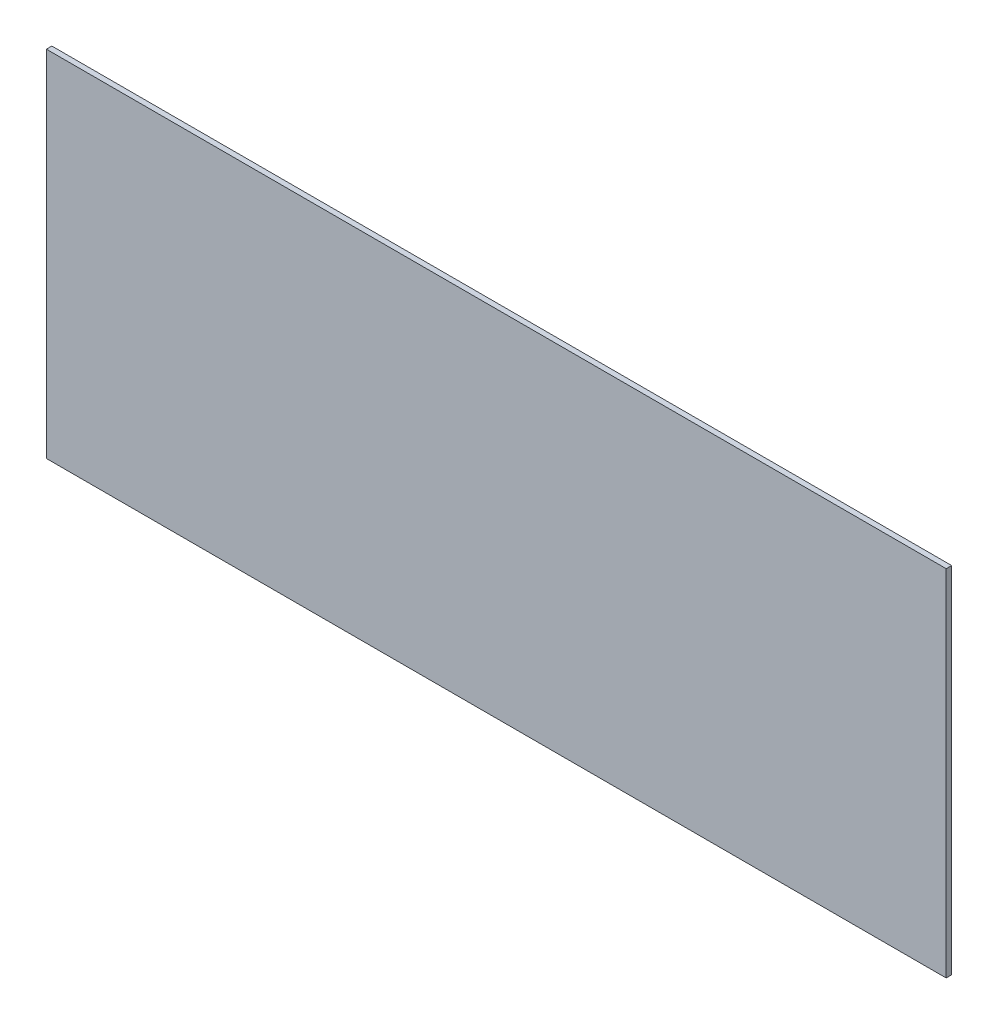
ISO-10303-21;
HEADER;
FILE_DESCRIPTION(('STEP AP214'),'2;1');
FILE_NAME('part.step','',(''),(''),'','','');
FILE_SCHEMA(('AUTOMOTIVE_DESIGN { 1 0 10303 214 1 1 1 1 }'));
ENDSEC;
DATA;
#1=APPLICATION_CONTEXT('core data for automotive mechanical design processes');
#2=APPLICATION_PROTOCOL_DEFINITION('international standard','automotive_design',2000,#1);
#3=PRODUCT_CONTEXT('',#1,'mechanical');
#4=PRODUCT('Part','Part','',(#3));
#5=PRODUCT_RELATED_PRODUCT_CATEGORY('part','',(#4));
#6=PRODUCT_DEFINITION_FORMATION('','',#4);
#7=PRODUCT_DEFINITION_CONTEXT('part definition',#1,'design');
#8=PRODUCT_DEFINITION('design','',#6,#7);
#9=PRODUCT_DEFINITION_SHAPE('','',#8);
#10=(LENGTH_UNIT() NAMED_UNIT(*) SI_UNIT(.MILLI.,.METRE.));
#11=(NAMED_UNIT(*) PLANE_ANGLE_UNIT() SI_UNIT($,.RADIAN.));
#12=(NAMED_UNIT(*) SI_UNIT($,.STERADIAN.) SOLID_ANGLE_UNIT());
#13=UNCERTAINTY_MEASURE_WITH_UNIT(LENGTH_MEASURE(1.E-05),#10,'distance_accuracy_value','');
#14=(GEOMETRIC_REPRESENTATION_CONTEXT(3) GLOBAL_UNCERTAINTY_ASSIGNED_CONTEXT((#13)) GLOBAL_UNIT_ASSIGNED_CONTEXT((#10,
#11,#12)) REPRESENTATION_CONTEXT('',''));
#15=CARTESIAN_POINT('',(0.,0.,0.));
#16=DIRECTION('',(0.,0.,1.));
#17=DIRECTION('',(1.,0.,0.));
#18=AXIS2_PLACEMENT_3D('',#15,#16,#17);
#19=CARTESIAN_POINT('',(82.5,-32.5,1.));
#20=DIRECTION('',(-1.,0.,0.));
#21=DIRECTION('',(0.,0.,1.));
#22=AXIS2_PLACEMENT_3D('',#19,#20,#21);
#23=PLANE('',#22);
#24=DIRECTION('',(0.,1.,0.));
#25=VECTOR('',#24,1.);
#26=CARTESIAN_POINT('',(82.5,-32.5,0.));
#27=LINE('',#26,#25);
#28=CARTESIAN_POINT('',(82.5,-32.5,0.));
#29=VERTEX_POINT('',#28);
#30=CARTESIAN_POINT('',(82.5,32.5,0.));
#31=VERTEX_POINT('',#30);
#32=EDGE_CURVE('E104',#29,#31,#27,.T.);
#33=ORIENTED_EDGE('',*,*,#32,.T.);
#34=DIRECTION('',(0.,0.,-1.));
#35=VECTOR('',#34,1.);
#36=CARTESIAN_POINT('',(82.5,32.5,1.));
#37=LINE('',#36,#35);
#38=CARTESIAN_POINT('',(82.5,32.5,1.));
#39=VERTEX_POINT('',#38);
#40=EDGE_CURVE('E11',#39,#31,#37,.T.);
#41=ORIENTED_EDGE('',*,*,#40,.F.);
#42=DIRECTION('',(0.,1.,0.));
#43=VECTOR('',#42,1.);
#44=CARTESIAN_POINT('',(82.5,-32.5,1.));
#45=LINE('',#44,#43);
#46=CARTESIAN_POINT('',(82.5,-32.5,1.));
#47=VERTEX_POINT('',#46);
#48=EDGE_CURVE('E92',#47,#39,#45,.T.);
#49=ORIENTED_EDGE('',*,*,#48,.F.);
#50=DIRECTION('',(0.,0.,-1.));
#51=VECTOR('',#50,1.);
#52=CARTESIAN_POINT('',(82.5,-32.5,1.));
#53=LINE('',#52,#51);
#54=EDGE_CURVE('E100',#47,#29,#53,.T.);
#55=ORIENTED_EDGE('',*,*,#54,.T.);
#56=EDGE_LOOP('',(#33,#41,#49,#55));
#57=FACE_BOUND('',#56,.T.);
#58=ADVANCED_FACE('F41',(#57),#23,.F.);
#59=CARTESIAN_POINT('',(-82.5,32.5,1.));
#60=DIRECTION('',(0.,-1.,0.));
#61=DIRECTION('',(0.,0.,-1.));
#62=AXIS2_PLACEMENT_3D('',#59,#60,#61);
#63=PLANE('',#62);
#64=DIRECTION('',(-1.,0.,0.));
#65=VECTOR('',#64,1.);
#66=CARTESIAN_POINT('',(-82.5,32.5,0.));
#67=LINE('',#66,#65);
#68=CARTESIAN_POINT('',(-82.5,32.5,0.));
#69=VERTEX_POINT('',#68);
#70=EDGE_CURVE('E96',#31,#69,#67,.T.);
#71=ORIENTED_EDGE('',*,*,#70,.T.);
#72=DIRECTION('',(0.,0.,-1.));
#73=VECTOR('',#72,1.);
#74=CARTESIAN_POINT('',(-82.5,32.5,1.));
#75=LINE('',#74,#73);
#76=CARTESIAN_POINT('',(-82.5,32.5,1.));
#77=VERTEX_POINT('',#76);
#78=EDGE_CURVE('E49',#77,#69,#75,.T.);
#79=ORIENTED_EDGE('',*,*,#78,.F.);
#80=DIRECTION('',(-1.,0.,0.));
#81=VECTOR('',#80,1.);
#82=CARTESIAN_POINT('',(-82.5,32.5,1.));
#83=LINE('',#82,#81);
#84=EDGE_CURVE('E87',#39,#77,#83,.T.);
#85=ORIENTED_EDGE('',*,*,#84,.F.);
#86=ORIENTED_EDGE('',*,*,#40,.T.);
#87=EDGE_LOOP('',(#71,#79,#85,#86));
#88=FACE_BOUND('',#87,.T.);
#89=ADVANCED_FACE('F95',(#88),#63,.F.);
#90=CARTESIAN_POINT('',(-82.5,-32.5,1.));
#91=DIRECTION('',(1.,0.,0.));
#92=DIRECTION('',(0.,0.,-1.));
#93=AXIS2_PLACEMENT_3D('',#90,#91,#92);
#94=PLANE('',#93);
#95=DIRECTION('',(0.,-1.,0.));
#96=VECTOR('',#95,1.);
#97=CARTESIAN_POINT('',(-82.5,-32.5,0.));
#98=LINE('',#97,#96);
#99=CARTESIAN_POINT('',(-82.5,-32.5,0.));
#100=VERTEX_POINT('',#99);
#101=EDGE_CURVE('E74',#69,#100,#98,.T.);
#102=ORIENTED_EDGE('',*,*,#101,.T.);
#103=DIRECTION('',(0.,0.,-1.));
#104=VECTOR('',#103,1.);
#105=CARTESIAN_POINT('',(-82.5,-32.5,1.));
#106=LINE('',#105,#104);
#107=CARTESIAN_POINT('',(-82.5,-32.5,1.));
#108=VERTEX_POINT('',#107);
#109=EDGE_CURVE('E97',#108,#100,#106,.T.);
#110=ORIENTED_EDGE('',*,*,#109,.F.);
#111=DIRECTION('',(0.,-1.,0.));
#112=VECTOR('',#111,1.);
#113=CARTESIAN_POINT('',(-82.5,-32.5,1.));
#114=LINE('',#113,#112);
#115=EDGE_CURVE('E90',#77,#108,#114,.T.);
#116=ORIENTED_EDGE('',*,*,#115,.F.);
#117=ORIENTED_EDGE('',*,*,#78,.T.);
#118=EDGE_LOOP('',(#102,#110,#116,#117));
#119=FACE_BOUND('',#118,.T.);
#120=ADVANCED_FACE('F98',(#119),#94,.F.);
#121=CARTESIAN_POINT('',(-82.5,-32.5,1.));
#122=DIRECTION('',(0.,1.,0.));
#123=DIRECTION('',(0.,0.,1.));
#124=AXIS2_PLACEMENT_3D('',#121,#122,#123);
#125=PLANE('',#124);
#126=DIRECTION('',(1.,0.,0.));
#127=VECTOR('',#126,1.);
#128=CARTESIAN_POINT('',(-82.5,-32.5,0.));
#129=LINE('',#128,#127);
#130=EDGE_CURVE('E80',#100,#29,#129,.T.);
#131=ORIENTED_EDGE('',*,*,#130,.T.);
#132=ORIENTED_EDGE('',*,*,#54,.F.);
#133=DIRECTION('',(1.,0.,0.));
#134=VECTOR('',#133,1.);
#135=CARTESIAN_POINT('',(-82.5,-32.5,1.));
#136=LINE('',#135,#134);
#137=EDGE_CURVE('E57',#108,#47,#136,.T.);
#138=ORIENTED_EDGE('',*,*,#137,.F.);
#139=ORIENTED_EDGE('',*,*,#109,.T.);
#140=EDGE_LOOP('',(#131,#132,#138,#139));
#141=FACE_BOUND('',#140,.T.);
#142=ADVANCED_FACE('F111',(#141),#125,.F.);
#143=CARTESIAN_POINT('',(0.,0.,1.));
#144=DIRECTION('',(0.,0.,-1.));
#145=DIRECTION('',(-1.,0.,0.));
#146=AXIS2_PLACEMENT_3D('',#143,#144,#145);
#147=PLANE('',#146);
#148=ORIENTED_EDGE('',*,*,#48,.T.);
#149=ORIENTED_EDGE('',*,*,#84,.T.);
#150=ORIENTED_EDGE('',*,*,#115,.T.);
#151=ORIENTED_EDGE('',*,*,#137,.T.);
#152=EDGE_LOOP('',(#148,#149,#150,#151));
#153=FACE_BOUND('',#152,.T.);
#154=ADVANCED_FACE('F88',(#153),#147,.F.);
#155=CARTESIAN_POINT('',(0.,0.,0.));
#156=DIRECTION('',(0.,0.,-1.));
#157=DIRECTION('',(-1.,0.,0.));
#158=AXIS2_PLACEMENT_3D('',#155,#156,#157);
#159=PLANE('',#158);
#160=ORIENTED_EDGE('',*,*,#32,.F.);
#161=ORIENTED_EDGE('',*,*,#130,.F.);
#162=ORIENTED_EDGE('',*,*,#101,.F.);
#163=ORIENTED_EDGE('',*,*,#70,.F.);
#164=EDGE_LOOP('',(#160,#161,#162,#163));
#165=FACE_BOUND('',#164,.T.);
#166=ADVANCED_FACE('F114',(#165),#159,.T.);
#167=CLOSED_SHELL('',(#58,#89,#120,#142,#154,#166));
#168=MANIFOLD_SOLID_BREP('B2',#167);
#169=ADVANCED_BREP_SHAPE_REPRESENTATION('',(#18,#168),#14);
#170=SHAPE_DEFINITION_REPRESENTATION(#9,#169);
ENDSEC;
END-ISO-10303-21;
